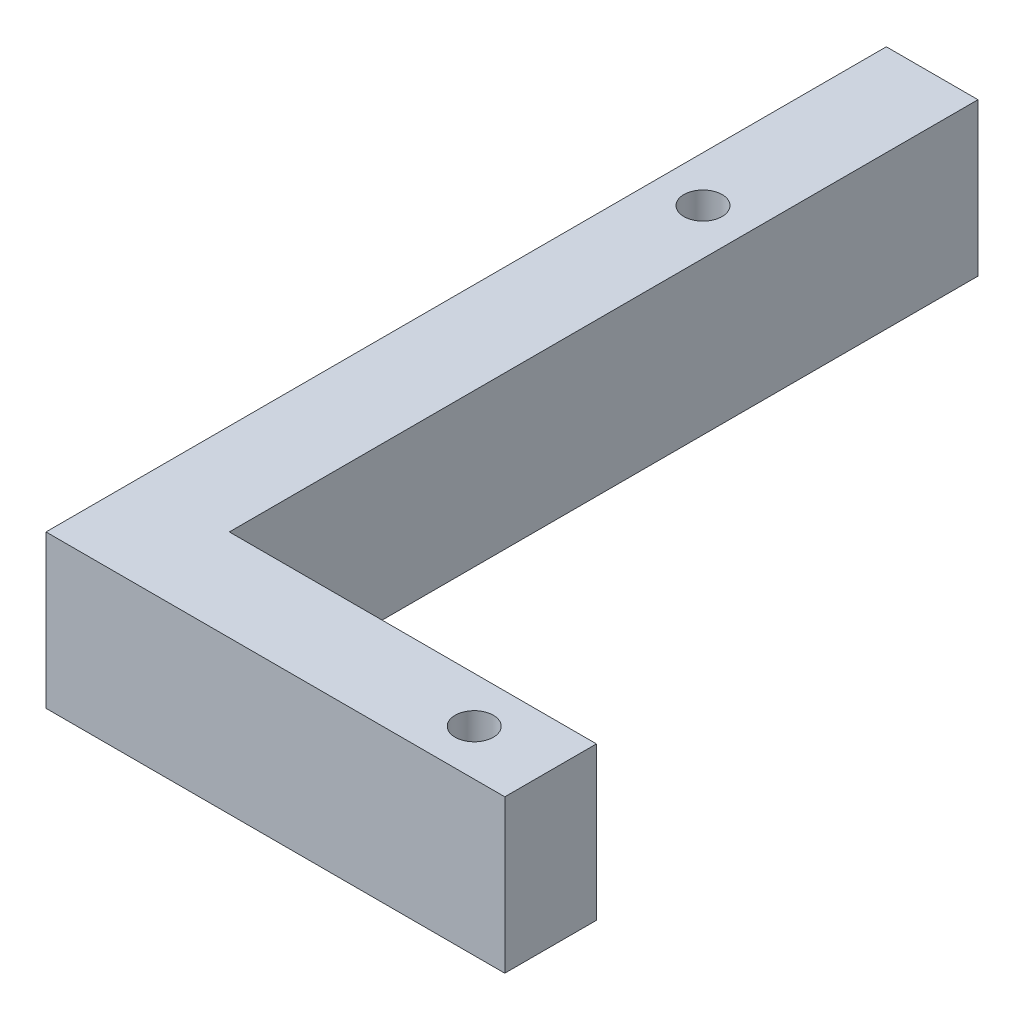
ISO-10303-21;
HEADER;
FILE_DESCRIPTION(('STEP AP214'),'2;1');
FILE_NAME('part.step','',(''),(''),'','','');
FILE_SCHEMA(('AUTOMOTIVE_DESIGN { 1 0 10303 214 1 1 1 1 }'));
ENDSEC;
DATA;
#1=APPLICATION_CONTEXT('core data for automotive mechanical design processes');
#2=APPLICATION_PROTOCOL_DEFINITION('international standard','automotive_design',2000,#1);
#3=PRODUCT_CONTEXT('',#1,'mechanical');
#4=PRODUCT('Part','Part','',(#3));
#5=PRODUCT_RELATED_PRODUCT_CATEGORY('part','',(#4));
#6=PRODUCT_DEFINITION_FORMATION('','',#4);
#7=PRODUCT_DEFINITION_CONTEXT('part definition',#1,'design');
#8=PRODUCT_DEFINITION('design','',#6,#7);
#9=PRODUCT_DEFINITION_SHAPE('','',#8);
#10=(LENGTH_UNIT() NAMED_UNIT(*) SI_UNIT(.MILLI.,.METRE.));
#11=(NAMED_UNIT(*) PLANE_ANGLE_UNIT() SI_UNIT($,.RADIAN.));
#12=(NAMED_UNIT(*) SI_UNIT($,.STERADIAN.) SOLID_ANGLE_UNIT());
#13=UNCERTAINTY_MEASURE_WITH_UNIT(LENGTH_MEASURE(1.E-05),#10,'distance_accuracy_value','');
#14=(GEOMETRIC_REPRESENTATION_CONTEXT(3) GLOBAL_UNCERTAINTY_ASSIGNED_CONTEXT((#13)) GLOBAL_UNIT_ASSIGNED_CONTEXT((#10,
#11,#12)) REPRESENTATION_CONTEXT('',''));
#15=CARTESIAN_POINT('',(0.,0.,0.));
#16=DIRECTION('',(0.,0.,1.));
#17=DIRECTION('',(1.,0.,0.));
#18=AXIS2_PLACEMENT_3D('',#15,#16,#17);
#19=CARTESIAN_POINT('',(6.,10.,0.));
#20=DIRECTION('',(-1.,0.,0.));
#21=DIRECTION('',(0.,0.,1.));
#22=AXIS2_PLACEMENT_3D('',#19,#20,#21);
#23=PLANE('',#22);
#24=DIRECTION('',(0.,0.,-1.));
#25=VECTOR('',#24,1.);
#26=CARTESIAN_POINT('',(6.,0.,0.));
#27=LINE('',#26,#25);
#28=CARTESIAN_POINT('',(6.,0.,-6.));
#29=VERTEX_POINT('',#28);
#30=CARTESIAN_POINT('',(6.,0.,-55.));
#31=VERTEX_POINT('',#30);
#32=EDGE_CURVE('E123',#29,#31,#27,.T.);
#33=ORIENTED_EDGE('',*,*,#32,.T.);
#34=DIRECTION('',(0.,-1.,0.));
#35=VECTOR('',#34,1.);
#36=CARTESIAN_POINT('',(6.,10.,-55.));
#37=LINE('',#36,#35);
#38=CARTESIAN_POINT('',(6.,10.,-55.));
#39=VERTEX_POINT('',#38);
#40=EDGE_CURVE('E11',#39,#31,#37,.T.);
#41=ORIENTED_EDGE('',*,*,#40,.F.);
#42=DIRECTION('',(0.,0.,-1.));
#43=VECTOR('',#42,1.);
#44=CARTESIAN_POINT('',(6.,10.,0.));
#45=LINE('',#44,#43);
#46=CARTESIAN_POINT('',(6.,10.,-6.));
#47=VERTEX_POINT('',#46);
#48=EDGE_CURVE('E82',#47,#39,#45,.T.);
#49=ORIENTED_EDGE('',*,*,#48,.F.);
#50=DIRECTION('',(0.,-1.,0.));
#51=VECTOR('',#50,1.);
#52=CARTESIAN_POINT('',(6.,10.,-6.));
#53=LINE('',#52,#51);
#54=EDGE_CURVE('E50',#47,#29,#53,.T.);
#55=ORIENTED_EDGE('',*,*,#54,.T.);
#56=EDGE_LOOP('',(#33,#41,#49,#55));
#57=FACE_BOUND('',#56,.T.);
#58=ADVANCED_FACE('F33',(#57),#23,.F.);
#59=CARTESIAN_POINT('',(0.,10.,-55.));
#60=DIRECTION('',(0.,0.,-1.));
#61=DIRECTION('',(-1.,0.,0.));
#62=AXIS2_PLACEMENT_3D('',#59,#60,#61);
#63=PLANE('',#62);
#64=DIRECTION('',(1.,0.,0.));
#65=VECTOR('',#64,1.);
#66=CARTESIAN_POINT('',(0.,0.,-55.));
#67=LINE('',#66,#65);
#68=CARTESIAN_POINT('',(0.,0.,-55.));
#69=VERTEX_POINT('',#68);
#70=EDGE_CURVE('E125',#69,#31,#67,.T.);
#71=ORIENTED_EDGE('',*,*,#70,.F.);
#72=DIRECTION('',(0.,-1.,0.));
#73=VECTOR('',#72,1.);
#74=CARTESIAN_POINT('',(0.,10.,-55.));
#75=LINE('',#74,#73);
#76=CARTESIAN_POINT('',(0.,10.,-55.));
#77=VERTEX_POINT('',#76);
#78=EDGE_CURVE('E42',#77,#69,#75,.T.);
#79=ORIENTED_EDGE('',*,*,#78,.F.);
#80=DIRECTION('',(1.,0.,0.));
#81=VECTOR('',#80,1.);
#82=CARTESIAN_POINT('',(0.,10.,-55.));
#83=LINE('',#82,#81);
#84=EDGE_CURVE('E232',#77,#39,#83,.T.);
#85=ORIENTED_EDGE('',*,*,#84,.T.);
#86=ORIENTED_EDGE('',*,*,#40,.T.);
#87=EDGE_LOOP('',(#71,#79,#85,#86));
#88=FACE_BOUND('',#87,.T.);
#89=ADVANCED_FACE('F149',(#88),#63,.T.);
#90=CARTESIAN_POINT('',(0.,10.,0.));
#91=DIRECTION('',(-1.,0.,0.));
#92=DIRECTION('',(0.,0.,1.));
#93=AXIS2_PLACEMENT_3D('',#90,#91,#92);
#94=PLANE('',#93);
#95=DIRECTION('',(0.,0.,-1.));
#96=VECTOR('',#95,1.);
#97=CARTESIAN_POINT('',(0.,0.,0.));
#98=LINE('',#97,#96);
#99=CARTESIAN_POINT('',(0.,0.,0.));
#100=VERTEX_POINT('',#99);
#101=EDGE_CURVE('E128',#100,#69,#98,.T.);
#102=ORIENTED_EDGE('',*,*,#101,.F.);
#103=DIRECTION('',(0.,-1.,0.));
#104=VECTOR('',#103,1.);
#105=CARTESIAN_POINT('',(0.,10.,0.));
#106=LINE('',#105,#104);
#107=CARTESIAN_POINT('',(0.,10.,0.));
#108=VERTEX_POINT('',#107);
#109=EDGE_CURVE('E109',#108,#100,#106,.T.);
#110=ORIENTED_EDGE('',*,*,#109,.F.);
#111=DIRECTION('',(0.,0.,-1.));
#112=VECTOR('',#111,1.);
#113=CARTESIAN_POINT('',(0.,10.,0.));
#114=LINE('',#113,#112);
#115=EDGE_CURVE('E99',#108,#77,#114,.T.);
#116=ORIENTED_EDGE('',*,*,#115,.T.);
#117=ORIENTED_EDGE('',*,*,#78,.T.);
#118=EDGE_LOOP('',(#102,#110,#116,#117));
#119=FACE_BOUND('',#118,.T.);
#120=ADVANCED_FACE('F146',(#119),#94,.T.);
#121=CARTESIAN_POINT('',(0.,10.,0.));
#122=DIRECTION('',(0.,0.,-1.));
#123=DIRECTION('',(-1.,0.,0.));
#124=AXIS2_PLACEMENT_3D('',#121,#122,#123);
#125=PLANE('',#124);
#126=DIRECTION('',(1.,0.,0.));
#127=VECTOR('',#126,1.);
#128=CARTESIAN_POINT('',(0.,0.,0.));
#129=LINE('',#128,#127);
#130=CARTESIAN_POINT('',(30.0280102109092,0.,0.));
#131=VERTEX_POINT('',#130);
#132=EDGE_CURVE('E106',#100,#131,#129,.T.);
#133=ORIENTED_EDGE('',*,*,#132,.T.);
#134=DIRECTION('',(0.,-1.,0.));
#135=VECTOR('',#134,1.);
#136=CARTESIAN_POINT('',(30.0280102109092,10.,0.));
#137=LINE('',#136,#135);
#138=CARTESIAN_POINT('',(30.0280102109092,10.,0.));
#139=VERTEX_POINT('',#138);
#140=EDGE_CURVE('E103',#139,#131,#137,.T.);
#141=ORIENTED_EDGE('',*,*,#140,.F.);
#142=DIRECTION('',(1.,0.,0.));
#143=VECTOR('',#142,1.);
#144=CARTESIAN_POINT('',(0.,10.,0.));
#145=LINE('',#144,#143);
#146=EDGE_CURVE('E92',#108,#139,#145,.T.);
#147=ORIENTED_EDGE('',*,*,#146,.F.);
#148=ORIENTED_EDGE('',*,*,#109,.T.);
#149=EDGE_LOOP('',(#133,#141,#147,#148));
#150=FACE_BOUND('',#149,.T.);
#151=ADVANCED_FACE('F104',(#150),#125,.F.);
#152=CARTESIAN_POINT('',(30.0280102109092,10.,0.));
#153=DIRECTION('',(-1.,0.,0.));
#154=DIRECTION('',(0.,0.,1.));
#155=AXIS2_PLACEMENT_3D('',#152,#153,#154);
#156=PLANE('',#155);
#157=DIRECTION('',(0.,0.,-1.));
#158=VECTOR('',#157,1.);
#159=CARTESIAN_POINT('',(30.0280102109092,0.,0.));
#160=LINE('',#159,#158);
#161=CARTESIAN_POINT('',(30.0280102109092,0.,-6.));
#162=VERTEX_POINT('',#161);
#163=EDGE_CURVE('E132',#131,#162,#160,.T.);
#164=ORIENTED_EDGE('',*,*,#163,.T.);
#165=DIRECTION('',(0.,-1.,0.));
#166=VECTOR('',#165,1.);
#167=CARTESIAN_POINT('',(30.0280102109092,10.,-6.));
#168=LINE('',#167,#166);
#169=CARTESIAN_POINT('',(30.0280102109092,10.,-6.));
#170=VERTEX_POINT('',#169);
#171=EDGE_CURVE('E70',#170,#162,#168,.T.);
#172=ORIENTED_EDGE('',*,*,#171,.F.);
#173=DIRECTION('',(0.,0.,-1.));
#174=VECTOR('',#173,1.);
#175=CARTESIAN_POINT('',(30.0280102109092,10.,0.));
#176=LINE('',#175,#174);
#177=EDGE_CURVE('E97',#139,#170,#176,.T.);
#178=ORIENTED_EDGE('',*,*,#177,.F.);
#179=ORIENTED_EDGE('',*,*,#140,.T.);
#180=EDGE_LOOP('',(#164,#172,#178,#179));
#181=FACE_BOUND('',#180,.T.);
#182=ADVANCED_FACE('F111',(#181),#156,.F.);
#183=CARTESIAN_POINT('',(0.,10.,-6.));
#184=DIRECTION('',(0.,0.,-1.));
#185=DIRECTION('',(-1.,0.,0.));
#186=AXIS2_PLACEMENT_3D('',#183,#184,#185);
#187=PLANE('',#186);
#188=DIRECTION('',(1.,0.,0.));
#189=VECTOR('',#188,1.);
#190=CARTESIAN_POINT('',(0.,0.,-6.));
#191=LINE('',#190,#189);
#192=EDGE_CURVE('E134',#29,#162,#191,.T.);
#193=ORIENTED_EDGE('',*,*,#192,.F.);
#194=ORIENTED_EDGE('',*,*,#54,.F.);
#195=DIRECTION('',(1.,0.,0.));
#196=VECTOR('',#195,1.);
#197=CARTESIAN_POINT('',(0.,10.,-6.));
#198=LINE('',#197,#196);
#199=EDGE_CURVE('E112',#47,#170,#198,.T.);
#200=ORIENTED_EDGE('',*,*,#199,.T.);
#201=ORIENTED_EDGE('',*,*,#171,.T.);
#202=EDGE_LOOP('',(#193,#194,#200,#201));
#203=FACE_BOUND('',#202,.T.);
#204=ADVANCED_FACE('F153',(#203),#187,.T.);
#205=CARTESIAN_POINT('',(3.,10.,-40.));
#206=DIRECTION('',(0.,-1.,0.));
#207=DIRECTION('',(0.,0.,-1.));
#208=AXIS2_PLACEMENT_3D('',#205,#206,#207);
#209=CYLINDRICAL_SURFACE('',#208,1.25);
#210=CARTESIAN_POINT('',(3.,10.,-40.));
#211=DIRECTION('',(0.,1.,0.));
#212=DIRECTION('',(0.,0.,1.));
#213=AXIS2_PLACEMENT_3D('',#210,#211,#212);
#214=CIRCLE('',#213,1.25);
#215=CARTESIAN_POINT('',(3.,10.,-38.75));
#216=VERTEX_POINT('',#215);
#217=EDGE_CURVE('E140',#216,#216,#214,.T.);
#218=ORIENTED_EDGE('',*,*,#217,.T.);
#219=EDGE_LOOP('',(#218));
#220=FACE_BOUND('',#219,.T.);
#221=CARTESIAN_POINT('',(3.,0.,-40.));
#222=DIRECTION('',(0.,1.,0.));
#223=DIRECTION('',(0.,0.,1.));
#224=AXIS2_PLACEMENT_3D('',#221,#222,#223);
#225=CIRCLE('',#224,1.25);
#226=CARTESIAN_POINT('',(3.,0.,-38.75));
#227=VERTEX_POINT('',#226);
#228=EDGE_CURVE('E120',#227,#227,#225,.T.);
#229=ORIENTED_EDGE('',*,*,#228,.F.);
#230=EDGE_LOOP('',(#229));
#231=FACE_BOUND('',#230,.T.);
#232=ADVANCED_FACE('F35',(#220,#231),#209,.F.);
#233=CARTESIAN_POINT('',(25.0280102109092,10.,-3.));
#234=DIRECTION('',(0.,-1.,0.));
#235=DIRECTION('',(0.,0.,-1.));
#236=AXIS2_PLACEMENT_3D('',#233,#234,#235);
#237=CYLINDRICAL_SURFACE('',#236,1.25);
#238=CARTESIAN_POINT('',(25.0280102109092,10.,-3.));
#239=DIRECTION('',(0.,1.,0.));
#240=DIRECTION('',(0.,0.,1.));
#241=AXIS2_PLACEMENT_3D('',#238,#239,#240);
#242=CIRCLE('',#241,1.25);
#243=CARTESIAN_POINT('',(25.0280102109092,10.,-1.75));
#244=VERTEX_POINT('',#243);
#245=EDGE_CURVE('E114',#244,#244,#242,.T.);
#246=ORIENTED_EDGE('',*,*,#245,.T.);
#247=EDGE_LOOP('',(#246));
#248=FACE_BOUND('',#247,.T.);
#249=CARTESIAN_POINT('',(25.0280102109092,0.,-3.));
#250=DIRECTION('',(0.,1.,0.));
#251=DIRECTION('',(0.,0.,1.));
#252=AXIS2_PLACEMENT_3D('',#249,#250,#251);
#253=CIRCLE('',#252,1.25);
#254=CARTESIAN_POINT('',(25.0280102109092,0.,-1.75));
#255=VERTEX_POINT('',#254);
#256=EDGE_CURVE('E137',#255,#255,#253,.T.);
#257=ORIENTED_EDGE('',*,*,#256,.F.);
#258=EDGE_LOOP('',(#257));
#259=FACE_BOUND('',#258,.T.);
#260=ADVANCED_FACE('F160',(#248,#259),#237,.F.);
#261=CARTESIAN_POINT('',(0.,10.,0.));
#262=DIRECTION('',(0.,1.,0.));
#263=DIRECTION('',(0.,0.,1.));
#264=AXIS2_PLACEMENT_3D('',#261,#262,#263);
#265=PLANE('',#264);
#266=ORIENTED_EDGE('',*,*,#217,.F.);
#267=EDGE_LOOP('',(#266));
#268=FACE_BOUND('',#267,.T.);
#269=ORIENTED_EDGE('',*,*,#48,.T.);
#270=ORIENTED_EDGE('',*,*,#84,.F.);
#271=ORIENTED_EDGE('',*,*,#115,.F.);
#272=ORIENTED_EDGE('',*,*,#146,.T.);
#273=ORIENTED_EDGE('',*,*,#177,.T.);
#274=ORIENTED_EDGE('',*,*,#199,.F.);
#275=EDGE_LOOP('',(#269,#270,#271,#272,#273,#274));
#276=FACE_BOUND('',#275,.T.);
#277=ORIENTED_EDGE('',*,*,#245,.F.);
#278=EDGE_LOOP('',(#277));
#279=FACE_BOUND('',#278,.T.);
#280=ADVANCED_FACE('F94',(#268,#276,#279),#265,.T.);
#281=CARTESIAN_POINT('',(0.,0.,0.));
#282=DIRECTION('',(0.,1.,0.));
#283=DIRECTION('',(0.,0.,1.));
#284=AXIS2_PLACEMENT_3D('',#281,#282,#283);
#285=PLANE('',#284);
#286=ORIENTED_EDGE('',*,*,#228,.T.);
#287=EDGE_LOOP('',(#286));
#288=FACE_BOUND('',#287,.T.);
#289=ORIENTED_EDGE('',*,*,#32,.F.);
#290=ORIENTED_EDGE('',*,*,#192,.T.);
#291=ORIENTED_EDGE('',*,*,#163,.F.);
#292=ORIENTED_EDGE('',*,*,#132,.F.);
#293=ORIENTED_EDGE('',*,*,#101,.T.);
#294=ORIENTED_EDGE('',*,*,#70,.T.);
#295=EDGE_LOOP('',(#289,#290,#291,#292,#293,#294));
#296=FACE_BOUND('',#295,.T.);
#297=ORIENTED_EDGE('',*,*,#256,.T.);
#298=EDGE_LOOP('',(#297));
#299=FACE_BOUND('',#298,.T.);
#300=ADVANCED_FACE('F151',(#288,#296,#299),#285,.F.);
#301=CLOSED_SHELL('',(#58,#89,#120,#151,#182,#204,#232,#260,#280,#300));
#302=MANIFOLD_SOLID_BREP('B2',#301);
#303=ADVANCED_BREP_SHAPE_REPRESENTATION('',(#18,#302),#14);
#304=SHAPE_DEFINITION_REPRESENTATION(#9,#303);
ENDSEC;
END-ISO-10303-21;
